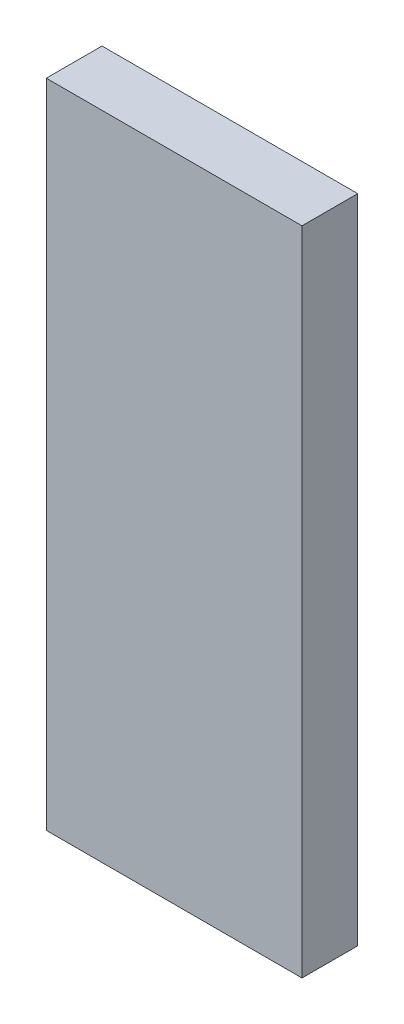
ISO-10303-21;
HEADER;
FILE_DESCRIPTION(('STEP AP214'),'2;1');
FILE_NAME('part.step','',(''),(''),'','','');
FILE_SCHEMA(('AUTOMOTIVE_DESIGN { 1 0 10303 214 1 1 1 1 }'));
ENDSEC;
DATA;
#1=APPLICATION_CONTEXT('core data for automotive mechanical design processes');
#2=APPLICATION_PROTOCOL_DEFINITION('international standard','automotive_design',2000,#1);
#3=PRODUCT_CONTEXT('',#1,'mechanical');
#4=PRODUCT('Part','Part','',(#3));
#5=PRODUCT_RELATED_PRODUCT_CATEGORY('part','',(#4));
#6=PRODUCT_DEFINITION_FORMATION('','',#4);
#7=PRODUCT_DEFINITION_CONTEXT('part definition',#1,'design');
#8=PRODUCT_DEFINITION('design','',#6,#7);
#9=PRODUCT_DEFINITION_SHAPE('','',#8);
#10=(LENGTH_UNIT() NAMED_UNIT(*) SI_UNIT(.MILLI.,.METRE.));
#11=(NAMED_UNIT(*) PLANE_ANGLE_UNIT() SI_UNIT($,.RADIAN.));
#12=(NAMED_UNIT(*) SI_UNIT($,.STERADIAN.) SOLID_ANGLE_UNIT());
#13=UNCERTAINTY_MEASURE_WITH_UNIT(LENGTH_MEASURE(1.E-05),#10,'distance_accuracy_value','');
#14=(GEOMETRIC_REPRESENTATION_CONTEXT(3) GLOBAL_UNCERTAINTY_ASSIGNED_CONTEXT((#13)) GLOBAL_UNIT_ASSIGNED_CONTEXT((#10,
#11,#12)) REPRESENTATION_CONTEXT('',''));
#15=CARTESIAN_POINT('',(0.,0.,0.));
#16=DIRECTION('',(0.,0.,1.));
#17=DIRECTION('',(1.,0.,0.));
#18=AXIS2_PLACEMENT_3D('',#15,#16,#17);
#19=CARTESIAN_POINT('',(-21.7182300884955,31.0897345132743,7.));
#20=DIRECTION('',(1.,0.,0.));
#21=DIRECTION('',(0.,1.,0.));
#22=AXIS2_PLACEMENT_3D('',#19,#20,#21);
#23=PLANE('',#22);
#24=DIRECTION('',(0.,-1.,0.));
#25=VECTOR('',#24,1.);
#26=CARTESIAN_POINT('',(-21.7182300884955,31.0897345132743,0.));
#27=LINE('',#26,#25);
#28=CARTESIAN_POINT('',(-21.7182300884955,31.0897345132743,0.));
#29=VERTEX_POINT('',#28);
#30=CARTESIAN_POINT('',(-21.7182300884955,-50.7375221238938,0.));
#31=VERTEX_POINT('',#30);
#32=EDGE_CURVE('E107',#29,#31,#27,.T.);
#33=ORIENTED_EDGE('',*,*,#32,.T.);
#34=DIRECTION('',(0.,0.,-1.));
#35=VECTOR('',#34,1.);
#36=CARTESIAN_POINT('',(-21.7182300884955,-50.7375221238938,7.));
#37=LINE('',#36,#35);
#38=CARTESIAN_POINT('',(-21.7182300884955,-50.7375221238938,7.));
#39=VERTEX_POINT('',#38);
#40=EDGE_CURVE('E11',#39,#31,#37,.T.);
#41=ORIENTED_EDGE('',*,*,#40,.F.);
#42=DIRECTION('',(0.,-1.,0.));
#43=VECTOR('',#42,1.);
#44=CARTESIAN_POINT('',(-21.7182300884955,31.0897345132743,7.));
#45=LINE('',#44,#43);
#46=CARTESIAN_POINT('',(-21.7182300884955,31.0897345132743,7.));
#47=VERTEX_POINT('',#46);
#48=EDGE_CURVE('E91',#47,#39,#45,.T.);
#49=ORIENTED_EDGE('',*,*,#48,.F.);
#50=DIRECTION('',(0.,0.,-1.));
#51=VECTOR('',#50,1.);
#52=CARTESIAN_POINT('',(-21.7182300884955,31.0897345132743,7.));
#53=LINE('',#52,#51);
#54=EDGE_CURVE('E103',#47,#29,#53,.T.);
#55=ORIENTED_EDGE('',*,*,#54,.T.);
#56=EDGE_LOOP('',(#33,#41,#49,#55));
#57=FACE_BOUND('',#56,.T.);
#58=ADVANCED_FACE('F39',(#57),#23,.F.);
#59=CARTESIAN_POINT('',(-21.7182300884955,-50.7375221238938,7.));
#60=DIRECTION('',(0.,1.,0.));
#61=DIRECTION('',(-1.,0.,0.));
#62=AXIS2_PLACEMENT_3D('',#59,#60,#61);
#63=PLANE('',#62);
#64=DIRECTION('',(1.,0.,0.));
#65=VECTOR('',#64,1.);
#66=CARTESIAN_POINT('',(-21.7182300884955,-50.7375221238938,0.));
#67=LINE('',#66,#65);
#68=CARTESIAN_POINT('',(10.4017699115044,-50.7375221238938,0.));
#69=VERTEX_POINT('',#68);
#70=EDGE_CURVE('E96',#31,#69,#67,.T.);
#71=ORIENTED_EDGE('',*,*,#70,.T.);
#72=DIRECTION('',(0.,0.,-1.));
#73=VECTOR('',#72,1.);
#74=CARTESIAN_POINT('',(10.4017699115044,-50.7375221238938,7.));
#75=LINE('',#74,#73);
#76=CARTESIAN_POINT('',(10.4017699115044,-50.7375221238938,7.));
#77=VERTEX_POINT('',#76);
#78=EDGE_CURVE('E48',#77,#69,#75,.T.);
#79=ORIENTED_EDGE('',*,*,#78,.F.);
#80=DIRECTION('',(1.,0.,0.));
#81=VECTOR('',#80,1.);
#82=CARTESIAN_POINT('',(-21.7182300884955,-50.7375221238938,7.));
#83=LINE('',#82,#81);
#84=EDGE_CURVE('E86',#39,#77,#83,.T.);
#85=ORIENTED_EDGE('',*,*,#84,.F.);
#86=ORIENTED_EDGE('',*,*,#40,.T.);
#87=EDGE_LOOP('',(#71,#79,#85,#86));
#88=FACE_BOUND('',#87,.T.);
#89=ADVANCED_FACE('F95',(#88),#63,.F.);
#90=CARTESIAN_POINT('',(10.4017699115044,31.0897345132743,7.));
#91=DIRECTION('',(-1.,0.,0.));
#92=DIRECTION('',(0.,0.,1.));
#93=AXIS2_PLACEMENT_3D('',#90,#91,#92);
#94=PLANE('',#93);
#95=DIRECTION('',(0.,1.,0.));
#96=VECTOR('',#95,1.);
#97=CARTESIAN_POINT('',(10.4017699115044,31.0897345132743,0.));
#98=LINE('',#97,#96);
#99=CARTESIAN_POINT('',(10.4017699115044,31.0897345132743,0.));
#100=VERTEX_POINT('',#99);
#101=EDGE_CURVE('E73',#69,#100,#98,.T.);
#102=ORIENTED_EDGE('',*,*,#101,.T.);
#103=DIRECTION('',(0.,0.,-1.));
#104=VECTOR('',#103,1.);
#105=CARTESIAN_POINT('',(10.4017699115044,31.0897345132743,7.));
#106=LINE('',#105,#104);
#107=CARTESIAN_POINT('',(10.4017699115044,31.0897345132743,7.));
#108=VERTEX_POINT('',#107);
#109=EDGE_CURVE('E98',#108,#100,#106,.T.);
#110=ORIENTED_EDGE('',*,*,#109,.F.);
#111=DIRECTION('',(0.,1.,0.));
#112=VECTOR('',#111,1.);
#113=CARTESIAN_POINT('',(10.4017699115044,31.0897345132743,7.));
#114=LINE('',#113,#112);
#115=EDGE_CURVE('E89',#77,#108,#114,.T.);
#116=ORIENTED_EDGE('',*,*,#115,.F.);
#117=ORIENTED_EDGE('',*,*,#78,.T.);
#118=EDGE_LOOP('',(#102,#110,#116,#117));
#119=FACE_BOUND('',#118,.T.);
#120=ADVANCED_FACE('F99',(#119),#94,.F.);
#121=CARTESIAN_POINT('',(-21.7182300884955,31.0897345132743,7.));
#122=DIRECTION('',(0.,-1.,0.));
#123=DIRECTION('',(0.,0.,-1.));
#124=AXIS2_PLACEMENT_3D('',#121,#122,#123);
#125=PLANE('',#124);
#126=DIRECTION('',(-1.,0.,0.));
#127=VECTOR('',#126,1.);
#128=CARTESIAN_POINT('',(-21.7182300884955,31.0897345132743,0.));
#129=LINE('',#128,#127);
#130=EDGE_CURVE('E79',#100,#29,#129,.T.);
#131=ORIENTED_EDGE('',*,*,#130,.T.);
#132=ORIENTED_EDGE('',*,*,#54,.F.);
#133=DIRECTION('',(-1.,0.,0.));
#134=VECTOR('',#133,1.);
#135=CARTESIAN_POINT('',(-21.7182300884955,31.0897345132743,7.));
#136=LINE('',#135,#134);
#137=EDGE_CURVE('E56',#108,#47,#136,.T.);
#138=ORIENTED_EDGE('',*,*,#137,.F.);
#139=ORIENTED_EDGE('',*,*,#109,.T.);
#140=EDGE_LOOP('',(#131,#132,#138,#139));
#141=FACE_BOUND('',#140,.T.);
#142=ADVANCED_FACE('F120',(#141),#125,.F.);
#143=CARTESIAN_POINT('',(0.,0.,7.));
#144=DIRECTION('',(0.,0.,1.));
#145=DIRECTION('',(1.,0.,0.));
#146=AXIS2_PLACEMENT_3D('',#143,#144,#145);
#147=PLANE('',#146);
#148=ORIENTED_EDGE('',*,*,#48,.T.);
#149=ORIENTED_EDGE('',*,*,#84,.T.);
#150=ORIENTED_EDGE('',*,*,#115,.T.);
#151=ORIENTED_EDGE('',*,*,#137,.T.);
#152=EDGE_LOOP('',(#148,#149,#150,#151));
#153=FACE_BOUND('',#152,.T.);
#154=ADVANCED_FACE('F87',(#153),#147,.T.);
#155=CARTESIAN_POINT('',(0.,0.,0.));
#156=DIRECTION('',(0.,0.,1.));
#157=DIRECTION('',(1.,0.,0.));
#158=AXIS2_PLACEMENT_3D('',#155,#156,#157);
#159=PLANE('',#158);
#160=ORIENTED_EDGE('',*,*,#32,.F.);
#161=ORIENTED_EDGE('',*,*,#130,.F.);
#162=ORIENTED_EDGE('',*,*,#101,.F.);
#163=ORIENTED_EDGE('',*,*,#70,.F.);
#164=EDGE_LOOP('',(#160,#161,#162,#163));
#165=FACE_BOUND('',#164,.T.);
#166=ADVANCED_FACE('F123',(#165),#159,.F.);
#167=CLOSED_SHELL('',(#58,#89,#120,#142,#154,#166));
#168=MANIFOLD_SOLID_BREP('B2',#167);
#169=ADVANCED_BREP_SHAPE_REPRESENTATION('',(#18,#168),#14);
#170=SHAPE_DEFINITION_REPRESENTATION(#9,#169);
ENDSEC;
END-ISO-10303-21;
